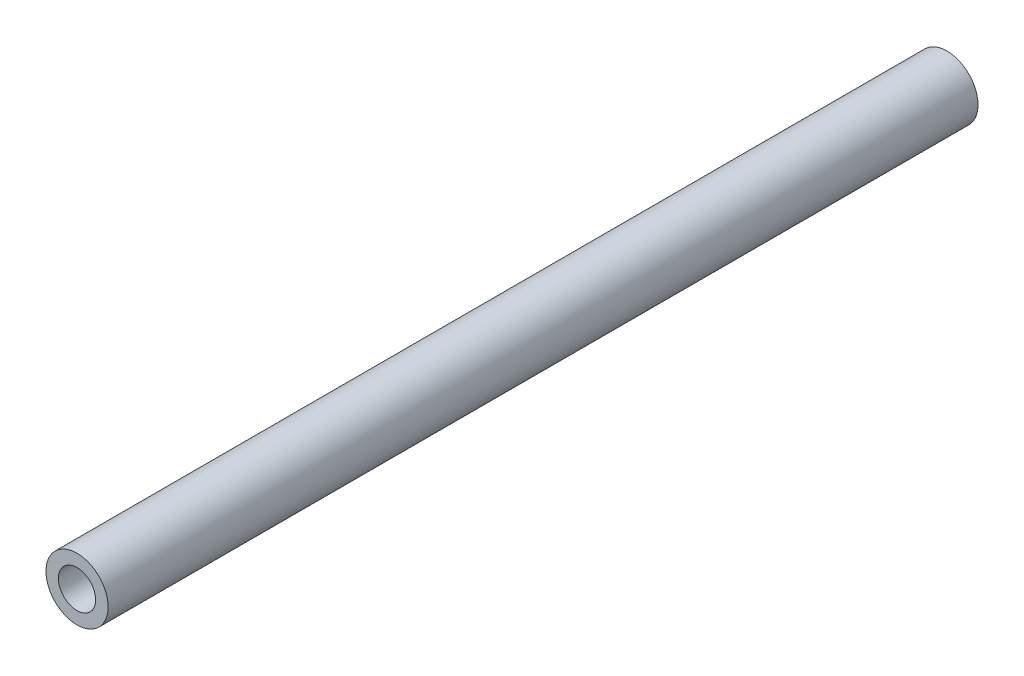
ISO-10303-21;
HEADER;
FILE_DESCRIPTION(('STEP AP214'),'2;1');
FILE_NAME('part.step','',(''),(''),'','','');
FILE_SCHEMA(('AUTOMOTIVE_DESIGN { 1 0 10303 214 1 1 1 1 }'));
ENDSEC;
DATA;
#1=APPLICATION_CONTEXT('core data for automotive mechanical design processes');
#2=APPLICATION_PROTOCOL_DEFINITION('international standard','automotive_design',2000,#1);
#3=PRODUCT_CONTEXT('',#1,'mechanical');
#4=PRODUCT('Part','Part','',(#3));
#5=PRODUCT_RELATED_PRODUCT_CATEGORY('part','',(#4));
#6=PRODUCT_DEFINITION_FORMATION('','',#4);
#7=PRODUCT_DEFINITION_CONTEXT('part definition',#1,'design');
#8=PRODUCT_DEFINITION('design','',#6,#7);
#9=PRODUCT_DEFINITION_SHAPE('','',#8);
#10=(LENGTH_UNIT() NAMED_UNIT(*) SI_UNIT(.MILLI.,.METRE.));
#11=(NAMED_UNIT(*) PLANE_ANGLE_UNIT() SI_UNIT($,.RADIAN.));
#12=(NAMED_UNIT(*) SI_UNIT($,.STERADIAN.) SOLID_ANGLE_UNIT());
#13=UNCERTAINTY_MEASURE_WITH_UNIT(LENGTH_MEASURE(1.E-05),#10,'distance_accuracy_value','');
#14=(GEOMETRIC_REPRESENTATION_CONTEXT(3) GLOBAL_UNCERTAINTY_ASSIGNED_CONTEXT((#13)) GLOBAL_UNIT_ASSIGNED_CONTEXT((#10,
#11,#12)) REPRESENTATION_CONTEXT('',''));
#15=CARTESIAN_POINT('',(0.,0.,0.));
#16=DIRECTION('',(0.,0.,1.));
#17=DIRECTION('',(1.,0.,0.));
#18=AXIS2_PLACEMENT_3D('',#15,#16,#17);
#19=CARTESIAN_POINT('',(0.,0.,70.));
#20=DIRECTION('',(0.,0.,1.));
#21=DIRECTION('',(1.,0.,0.));
#22=AXIS2_PLACEMENT_3D('',#19,#20,#21);
#23=PLANE('',#22);
#24=CARTESIAN_POINT('',(0.,0.,70.));
#25=DIRECTION('',(0.,0.,1.));
#26=DIRECTION('',(1.,0.,0.));
#27=AXIS2_PLACEMENT_3D('',#24,#25,#26);
#28=CIRCLE('',#27,2.5);
#29=CARTESIAN_POINT('',(2.5,0.,70.));
#30=VERTEX_POINT('',#29);
#31=EDGE_CURVE('E10',#30,#30,#28,.T.);
#32=ORIENTED_EDGE('',*,*,#31,.T.);
#33=EDGE_LOOP('',(#32));
#34=FACE_BOUND('',#33,.T.);
#35=CARTESIAN_POINT('',(0.,0.,70.));
#36=DIRECTION('',(0.,0.,1.));
#37=DIRECTION('',(1.,0.,0.));
#38=AXIS2_PLACEMENT_3D('',#35,#36,#37);
#39=CIRCLE('',#38,1.5);
#40=CARTESIAN_POINT('',(1.5,0.,70.));
#41=VERTEX_POINT('',#40);
#42=EDGE_CURVE('E50',#41,#41,#39,.T.);
#43=ORIENTED_EDGE('',*,*,#42,.F.);
#44=EDGE_LOOP('',(#43));
#45=FACE_BOUND('',#44,.T.);
#46=ADVANCED_FACE('F39',(#34,#45),#23,.T.);
#47=CARTESIAN_POINT('',(0.,0.,0.));
#48=DIRECTION('',(0.,0.,1.));
#49=DIRECTION('',(1.,0.,0.));
#50=AXIS2_PLACEMENT_3D('',#47,#48,#49);
#51=PLANE('',#50);
#52=CARTESIAN_POINT('',(0.,0.,0.));
#53=DIRECTION('',(0.,0.,1.));
#54=DIRECTION('',(1.,0.,0.));
#55=AXIS2_PLACEMENT_3D('',#52,#53,#54);
#56=CIRCLE('',#55,2.5);
#57=CARTESIAN_POINT('',(2.5,0.,0.));
#58=VERTEX_POINT('',#57);
#59=EDGE_CURVE('E43',#58,#58,#56,.T.);
#60=ORIENTED_EDGE('',*,*,#59,.F.);
#61=EDGE_LOOP('',(#60));
#62=FACE_BOUND('',#61,.T.);
#63=CARTESIAN_POINT('',(0.,0.,0.));
#64=DIRECTION('',(0.,0.,1.));
#65=DIRECTION('',(1.,0.,0.));
#66=AXIS2_PLACEMENT_3D('',#63,#64,#65);
#67=CIRCLE('',#66,1.5);
#68=CARTESIAN_POINT('',(1.5,0.,0.));
#69=VERTEX_POINT('',#68);
#70=EDGE_CURVE('E52',#69,#69,#67,.T.);
#71=ORIENTED_EDGE('',*,*,#70,.T.);
#72=EDGE_LOOP('',(#71));
#73=FACE_BOUND('',#72,.T.);
#74=ADVANCED_FACE('F62',(#62,#73),#51,.F.);
#75=CARTESIAN_POINT('',(0.,0.,70.));
#76=DIRECTION('',(0.,0.,-1.));
#77=DIRECTION('',(-1.,0.,0.));
#78=AXIS2_PLACEMENT_3D('',#75,#76,#77);
#79=CYLINDRICAL_SURFACE('',#78,2.5);
#80=ORIENTED_EDGE('',*,*,#31,.F.);
#81=EDGE_LOOP('',(#80));
#82=FACE_BOUND('',#81,.T.);
#83=ORIENTED_EDGE('',*,*,#59,.T.);
#84=EDGE_LOOP('',(#83));
#85=FACE_BOUND('',#84,.T.);
#86=ADVANCED_FACE('F41',(#82,#85),#79,.T.);
#87=CARTESIAN_POINT('',(0.,0.,70.));
#88=DIRECTION('',(0.,0.,-1.));
#89=DIRECTION('',(-1.,0.,0.));
#90=AXIS2_PLACEMENT_3D('',#87,#88,#89);
#91=CYLINDRICAL_SURFACE('',#90,1.5);
#92=ORIENTED_EDGE('',*,*,#42,.T.);
#93=EDGE_LOOP('',(#92));
#94=FACE_BOUND('',#93,.T.);
#95=ORIENTED_EDGE('',*,*,#70,.F.);
#96=EDGE_LOOP('',(#95));
#97=FACE_BOUND('',#96,.T.);
#98=ADVANCED_FACE('F58',(#94,#97),#91,.F.);
#99=CLOSED_SHELL('',(#46,#74,#86,#98));
#100=MANIFOLD_SOLID_BREP('B2',#99);
#101=ADVANCED_BREP_SHAPE_REPRESENTATION('',(#18,#100),#14);
#102=SHAPE_DEFINITION_REPRESENTATION(#9,#101);
ENDSEC;
END-ISO-10303-21;
